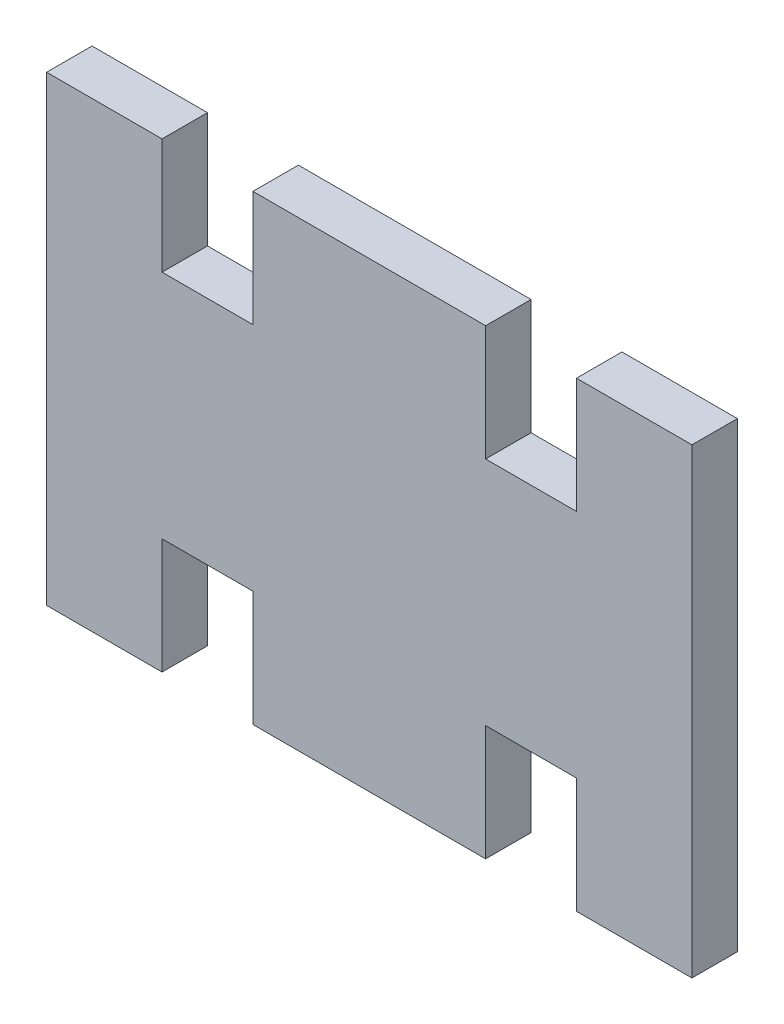
ISO-10303-21;
HEADER;
FILE_DESCRIPTION(('STEP AP214'),'2;1');
FILE_NAME('part.step','',(''),(''),'','','');
FILE_SCHEMA(('AUTOMOTIVE_DESIGN { 1 0 10303 214 1 1 1 1 }'));
ENDSEC;
DATA;
#1=APPLICATION_CONTEXT('core data for automotive mechanical design processes');
#2=APPLICATION_PROTOCOL_DEFINITION('international standard','automotive_design',2000,#1);
#3=PRODUCT_CONTEXT('',#1,'mechanical');
#4=PRODUCT('Part','Part','',(#3));
#5=PRODUCT_RELATED_PRODUCT_CATEGORY('part','',(#4));
#6=PRODUCT_DEFINITION_FORMATION('','',#4);
#7=PRODUCT_DEFINITION_CONTEXT('part definition',#1,'design');
#8=PRODUCT_DEFINITION('design','',#6,#7);
#9=PRODUCT_DEFINITION_SHAPE('','',#8);
#10=(LENGTH_UNIT() NAMED_UNIT(*) SI_UNIT(.MILLI.,.METRE.));
#11=(NAMED_UNIT(*) PLANE_ANGLE_UNIT() SI_UNIT($,.RADIAN.));
#12=(NAMED_UNIT(*) SI_UNIT($,.STERADIAN.) SOLID_ANGLE_UNIT());
#13=UNCERTAINTY_MEASURE_WITH_UNIT(LENGTH_MEASURE(1.E-05),#10,'distance_accuracy_value','');
#14=(GEOMETRIC_REPRESENTATION_CONTEXT(3) GLOBAL_UNCERTAINTY_ASSIGNED_CONTEXT((#13)) GLOBAL_UNIT_ASSIGNED_CONTEXT((#10,
#11,#12)) REPRESENTATION_CONTEXT('',''));
#15=CARTESIAN_POINT('',(0.,0.,0.));
#16=DIRECTION('',(0.,0.,1.));
#17=DIRECTION('',(1.,0.,0.));
#18=AXIS2_PLACEMENT_3D('',#15,#16,#17);
#19=CARTESIAN_POINT('',(-35.5,-25.4,5.));
#20=DIRECTION('',(1.,0.,0.));
#21=DIRECTION('',(0.,0.,-1.));
#22=AXIS2_PLACEMENT_3D('',#19,#20,#21);
#23=PLANE('',#22);
#24=DIRECTION('',(0.,-1.,0.));
#25=VECTOR('',#24,1.);
#26=CARTESIAN_POINT('',(-35.5,-25.4,0.));
#27=LINE('',#26,#25);
#28=CARTESIAN_POINT('',(-35.5,25.4,0.));
#29=VERTEX_POINT('',#28);
#30=CARTESIAN_POINT('',(-35.5,-25.4,0.));
#31=VERTEX_POINT('',#30);
#32=EDGE_CURVE('E205',#29,#31,#27,.T.);
#33=ORIENTED_EDGE('',*,*,#32,.T.);
#34=DIRECTION('',(0.,0.,-1.));
#35=VECTOR('',#34,1.);
#36=CARTESIAN_POINT('',(-35.5,-25.4,5.));
#37=LINE('',#36,#35);
#38=CARTESIAN_POINT('',(-35.5,-25.4,5.));
#39=VERTEX_POINT('',#38);
#40=EDGE_CURVE('E11',#39,#31,#37,.T.);
#41=ORIENTED_EDGE('',*,*,#40,.F.);
#42=DIRECTION('',(0.,-1.,0.));
#43=VECTOR('',#42,1.);
#44=CARTESIAN_POINT('',(-35.5,-25.4,5.));
#45=LINE('',#44,#43);
#46=CARTESIAN_POINT('',(-35.5,25.4,5.));
#47=VERTEX_POINT('',#46);
#48=EDGE_CURVE('E243',#47,#39,#45,.T.);
#49=ORIENTED_EDGE('',*,*,#48,.F.);
#50=DIRECTION('',(0.,0.,-1.));
#51=VECTOR('',#50,1.);
#52=CARTESIAN_POINT('',(-35.5,25.4,5.));
#53=LINE('',#52,#51);
#54=EDGE_CURVE('E201',#47,#29,#53,.T.);
#55=ORIENTED_EDGE('',*,*,#54,.T.);
#56=EDGE_LOOP('',(#33,#41,#49,#55));
#57=FACE_BOUND('',#56,.T.);
#58=ADVANCED_FACE('F37',(#57),#23,.F.);
#59=CARTESIAN_POINT('',(-35.5,-25.4,5.));
#60=DIRECTION('',(0.,1.,0.));
#61=DIRECTION('',(-1.,0.,0.));
#62=AXIS2_PLACEMENT_3D('',#59,#60,#61);
#63=PLANE('',#62);
#64=DIRECTION('',(1.,0.,0.));
#65=VECTOR('',#64,1.);
#66=CARTESIAN_POINT('',(-35.5,-25.4,0.));
#67=LINE('',#66,#65);
#68=CARTESIAN_POINT('',(-22.8,-25.4,0.));
#69=VERTEX_POINT('',#68);
#70=EDGE_CURVE('E208',#31,#69,#67,.T.);
#71=ORIENTED_EDGE('',*,*,#70,.T.);
#72=DIRECTION('',(0.,0.,-1.));
#73=VECTOR('',#72,1.);
#74=CARTESIAN_POINT('',(-22.8,-25.4,5.));
#75=LINE('',#74,#73);
#76=CARTESIAN_POINT('',(-22.8,-25.4,5.));
#77=VERTEX_POINT('',#76);
#78=EDGE_CURVE('E45',#77,#69,#75,.T.);
#79=ORIENTED_EDGE('',*,*,#78,.F.);
#80=DIRECTION('',(1.,0.,0.));
#81=VECTOR('',#80,1.);
#82=CARTESIAN_POINT('',(-35.5,-25.4,5.));
#83=LINE('',#82,#81);
#84=EDGE_CURVE('E132',#39,#77,#83,.T.);
#85=ORIENTED_EDGE('',*,*,#84,.F.);
#86=ORIENTED_EDGE('',*,*,#40,.T.);
#87=EDGE_LOOP('',(#71,#79,#85,#86));
#88=FACE_BOUND('',#87,.T.);
#89=ADVANCED_FACE('F361',(#88),#63,.F.);
#90=CARTESIAN_POINT('',(-22.8,-25.4,5.));
#91=DIRECTION('',(-1.,0.,0.));
#92=DIRECTION('',(0.,0.,1.));
#93=AXIS2_PLACEMENT_3D('',#90,#91,#92);
#94=PLANE('',#93);
#95=DIRECTION('',(0.,1.,0.));
#96=VECTOR('',#95,1.);
#97=CARTESIAN_POINT('',(-22.8,-25.4,0.));
#98=LINE('',#97,#96);
#99=CARTESIAN_POINT('',(-22.8,-12.7,0.));
#100=VERTEX_POINT('',#99);
#101=EDGE_CURVE('E210',#69,#100,#98,.T.);
#102=ORIENTED_EDGE('',*,*,#101,.T.);
#103=DIRECTION('',(0.,0.,-1.));
#104=VECTOR('',#103,1.);
#105=CARTESIAN_POINT('',(-22.8,-12.7,5.));
#106=LINE('',#105,#104);
#107=CARTESIAN_POINT('',(-22.8,-12.7,5.));
#108=VERTEX_POINT('',#107);
#109=EDGE_CURVE('E286',#108,#100,#106,.T.);
#110=ORIENTED_EDGE('',*,*,#109,.F.);
#111=DIRECTION('',(0.,1.,0.));
#112=VECTOR('',#111,1.);
#113=CARTESIAN_POINT('',(-22.8,-25.4,5.));
#114=LINE('',#113,#112);
#115=EDGE_CURVE('E294',#77,#108,#114,.T.);
#116=ORIENTED_EDGE('',*,*,#115,.F.);
#117=ORIENTED_EDGE('',*,*,#78,.T.);
#118=EDGE_LOOP('',(#102,#110,#116,#117));
#119=FACE_BOUND('',#118,.T.);
#120=ADVANCED_FACE('F292',(#119),#94,.F.);
#121=CARTESIAN_POINT('',(-22.8,-12.7,5.));
#122=DIRECTION('',(0.,1.,0.));
#123=DIRECTION('',(-1.,0.,0.));
#124=AXIS2_PLACEMENT_3D('',#121,#122,#123);
#125=PLANE('',#124);
#126=DIRECTION('',(1.,0.,0.));
#127=VECTOR('',#126,1.);
#128=CARTESIAN_POINT('',(-22.8,-12.7,0.));
#129=LINE('',#128,#127);
#130=CARTESIAN_POINT('',(-12.8,-12.7,0.));
#131=VERTEX_POINT('',#130);
#132=EDGE_CURVE('E212',#100,#131,#129,.T.);
#133=ORIENTED_EDGE('',*,*,#132,.T.);
#134=DIRECTION('',(0.,0.,-1.));
#135=VECTOR('',#134,1.);
#136=CARTESIAN_POINT('',(-12.8,-12.7,5.));
#137=LINE('',#136,#135);
#138=CARTESIAN_POINT('',(-12.8,-12.7,5.));
#139=VERTEX_POINT('',#138);
#140=EDGE_CURVE('E283',#139,#131,#137,.T.);
#141=ORIENTED_EDGE('',*,*,#140,.F.);
#142=DIRECTION('',(1.,0.,0.));
#143=VECTOR('',#142,1.);
#144=CARTESIAN_POINT('',(-22.8,-12.7,5.));
#145=LINE('',#144,#143);
#146=EDGE_CURVE('E312',#108,#139,#145,.T.);
#147=ORIENTED_EDGE('',*,*,#146,.F.);
#148=ORIENTED_EDGE('',*,*,#109,.T.);
#149=EDGE_LOOP('',(#133,#141,#147,#148));
#150=FACE_BOUND('',#149,.T.);
#151=ADVANCED_FACE('F303',(#150),#125,.F.);
#152=CARTESIAN_POINT('',(-12.8,-12.7,5.));
#153=DIRECTION('',(1.,0.,0.));
#154=DIRECTION('',(0.,1.,0.));
#155=AXIS2_PLACEMENT_3D('',#152,#153,#154);
#156=PLANE('',#155);
#157=DIRECTION('',(0.,-1.,0.));
#158=VECTOR('',#157,1.);
#159=CARTESIAN_POINT('',(-12.8,-12.7,0.));
#160=LINE('',#159,#158);
#161=CARTESIAN_POINT('',(-12.8,-25.4,0.));
#162=VERTEX_POINT('',#161);
#163=EDGE_CURVE('E214',#131,#162,#160,.T.);
#164=ORIENTED_EDGE('',*,*,#163,.T.);
#165=DIRECTION('',(0.,0.,-1.));
#166=VECTOR('',#165,1.);
#167=CARTESIAN_POINT('',(-12.8,-25.4,5.));
#168=LINE('',#167,#166);
#169=CARTESIAN_POINT('',(-12.8,-25.4,5.));
#170=VERTEX_POINT('',#169);
#171=EDGE_CURVE('E280',#170,#162,#168,.T.);
#172=ORIENTED_EDGE('',*,*,#171,.F.);
#173=DIRECTION('',(0.,-1.,0.));
#174=VECTOR('',#173,1.);
#175=CARTESIAN_POINT('',(-12.8,-12.7,5.));
#176=LINE('',#175,#174);
#177=EDGE_CURVE('E309',#139,#170,#176,.T.);
#178=ORIENTED_EDGE('',*,*,#177,.F.);
#179=ORIENTED_EDGE('',*,*,#140,.T.);
#180=EDGE_LOOP('',(#164,#172,#178,#179));
#181=FACE_BOUND('',#180,.T.);
#182=ADVANCED_FACE('F307',(#181),#156,.F.);
#183=CARTESIAN_POINT('',(-12.8,-25.4,5.));
#184=DIRECTION('',(0.,1.,0.));
#185=DIRECTION('',(0.,0.,1.));
#186=AXIS2_PLACEMENT_3D('',#183,#184,#185);
#187=PLANE('',#186);
#188=DIRECTION('',(1.,0.,0.));
#189=VECTOR('',#188,1.);
#190=CARTESIAN_POINT('',(-12.8,-25.4,0.));
#191=LINE('',#190,#189);
#192=CARTESIAN_POINT('',(12.8,-25.4,0.));
#193=VERTEX_POINT('',#192);
#194=EDGE_CURVE('E216',#162,#193,#191,.T.);
#195=ORIENTED_EDGE('',*,*,#194,.T.);
#196=DIRECTION('',(0.,0.,-1.));
#197=VECTOR('',#196,1.);
#198=CARTESIAN_POINT('',(12.8,-25.4,5.));
#199=LINE('',#198,#197);
#200=CARTESIAN_POINT('',(12.8,-25.4,5.));
#201=VERTEX_POINT('',#200);
#202=EDGE_CURVE('E277',#201,#193,#199,.T.);
#203=ORIENTED_EDGE('',*,*,#202,.F.);
#204=DIRECTION('',(1.,0.,0.));
#205=VECTOR('',#204,1.);
#206=CARTESIAN_POINT('',(-12.8,-25.4,5.));
#207=LINE('',#206,#205);
#208=EDGE_CURVE('E311',#170,#201,#207,.T.);
#209=ORIENTED_EDGE('',*,*,#208,.F.);
#210=ORIENTED_EDGE('',*,*,#171,.T.);
#211=EDGE_LOOP('',(#195,#203,#209,#210));
#212=FACE_BOUND('',#211,.T.);
#213=ADVANCED_FACE('F374',(#212),#187,.F.);
#214=CARTESIAN_POINT('',(12.8,-12.7,5.));
#215=DIRECTION('',(-1.,0.,0.));
#216=DIRECTION('',(0.,0.,1.));
#217=AXIS2_PLACEMENT_3D('',#214,#215,#216);
#218=PLANE('',#217);
#219=DIRECTION('',(0.,1.,0.));
#220=VECTOR('',#219,1.);
#221=CARTESIAN_POINT('',(12.8,-12.7,0.));
#222=LINE('',#221,#220);
#223=CARTESIAN_POINT('',(12.8,-12.7,0.));
#224=VERTEX_POINT('',#223);
#225=EDGE_CURVE('E218',#193,#224,#222,.T.);
#226=ORIENTED_EDGE('',*,*,#225,.T.);
#227=DIRECTION('',(0.,0.,-1.));
#228=VECTOR('',#227,1.);
#229=CARTESIAN_POINT('',(12.8,-12.7,5.));
#230=LINE('',#229,#228);
#231=CARTESIAN_POINT('',(12.8,-12.7,5.));
#232=VERTEX_POINT('',#231);
#233=EDGE_CURVE('E274',#232,#224,#230,.T.);
#234=ORIENTED_EDGE('',*,*,#233,.F.);
#235=DIRECTION('',(0.,1.,0.));
#236=VECTOR('',#235,1.);
#237=CARTESIAN_POINT('',(12.8,-12.7,5.));
#238=LINE('',#237,#236);
#239=EDGE_CURVE('E314',#201,#232,#238,.T.);
#240=ORIENTED_EDGE('',*,*,#239,.F.);
#241=ORIENTED_EDGE('',*,*,#202,.T.);
#242=EDGE_LOOP('',(#226,#234,#240,#241));
#243=FACE_BOUND('',#242,.T.);
#244=ADVANCED_FACE('F377',(#243),#218,.F.);
#245=CARTESIAN_POINT('',(22.8,-12.7,5.));
#246=DIRECTION('',(0.,1.,0.));
#247=DIRECTION('',(-1.,0.,0.));
#248=AXIS2_PLACEMENT_3D('',#245,#246,#247);
#249=PLANE('',#248);
#250=DIRECTION('',(1.,0.,0.));
#251=VECTOR('',#250,1.);
#252=CARTESIAN_POINT('',(22.8,-12.7,0.));
#253=LINE('',#252,#251);
#254=CARTESIAN_POINT('',(22.8,-12.7,0.));
#255=VERTEX_POINT('',#254);
#256=EDGE_CURVE('E220',#224,#255,#253,.T.);
#257=ORIENTED_EDGE('',*,*,#256,.T.);
#258=DIRECTION('',(0.,0.,-1.));
#259=VECTOR('',#258,1.);
#260=CARTESIAN_POINT('',(22.8,-12.7,5.));
#261=LINE('',#260,#259);
#262=CARTESIAN_POINT('',(22.8,-12.7,5.));
#263=VERTEX_POINT('',#262);
#264=EDGE_CURVE('E271',#263,#255,#261,.T.);
#265=ORIENTED_EDGE('',*,*,#264,.F.);
#266=DIRECTION('',(1.,0.,0.));
#267=VECTOR('',#266,1.);
#268=CARTESIAN_POINT('',(22.8,-12.7,5.));
#269=LINE('',#268,#267);
#270=EDGE_CURVE('E320',#232,#263,#269,.T.);
#271=ORIENTED_EDGE('',*,*,#270,.F.);
#272=ORIENTED_EDGE('',*,*,#233,.T.);
#273=EDGE_LOOP('',(#257,#265,#271,#272));
#274=FACE_BOUND('',#273,.T.);
#275=ADVANCED_FACE('F381',(#274),#249,.F.);
#276=CARTESIAN_POINT('',(22.8,-25.4,5.));
#277=DIRECTION('',(1.,0.,0.));
#278=DIRECTION('',(0.,0.,-1.));
#279=AXIS2_PLACEMENT_3D('',#276,#277,#278);
#280=PLANE('',#279);
#281=DIRECTION('',(0.,-1.,0.));
#282=VECTOR('',#281,1.);
#283=CARTESIAN_POINT('',(22.8,-25.4,0.));
#284=LINE('',#283,#282);
#285=CARTESIAN_POINT('',(22.8,-25.4,0.));
#286=VERTEX_POINT('',#285);
#287=EDGE_CURVE('E222',#255,#286,#284,.T.);
#288=ORIENTED_EDGE('',*,*,#287,.T.);
#289=DIRECTION('',(0.,0.,-1.));
#290=VECTOR('',#289,1.);
#291=CARTESIAN_POINT('',(22.8,-25.4,5.));
#292=LINE('',#291,#290);
#293=CARTESIAN_POINT('',(22.8,-25.4,5.));
#294=VERTEX_POINT('',#293);
#295=EDGE_CURVE('E268',#294,#286,#292,.T.);
#296=ORIENTED_EDGE('',*,*,#295,.F.);
#297=DIRECTION('',(0.,-1.,0.));
#298=VECTOR('',#297,1.);
#299=CARTESIAN_POINT('',(22.8,-25.4,5.));
#300=LINE('',#299,#298);
#301=EDGE_CURVE('E322',#263,#294,#300,.T.);
#302=ORIENTED_EDGE('',*,*,#301,.F.);
#303=ORIENTED_EDGE('',*,*,#264,.T.);
#304=EDGE_LOOP('',(#288,#296,#302,#303));
#305=FACE_BOUND('',#304,.T.);
#306=ADVANCED_FACE('F385',(#305),#280,.F.);
#307=CARTESIAN_POINT('',(35.5,-25.4,5.));
#308=DIRECTION('',(0.,1.,0.));
#309=DIRECTION('',(-1.,0.,0.));
#310=AXIS2_PLACEMENT_3D('',#307,#308,#309);
#311=PLANE('',#310);
#312=DIRECTION('',(1.,0.,0.));
#313=VECTOR('',#312,1.);
#314=CARTESIAN_POINT('',(35.5,-25.4,0.));
#315=LINE('',#314,#313);
#316=CARTESIAN_POINT('',(35.5,-25.4,0.));
#317=VERTEX_POINT('',#316);
#318=EDGE_CURVE('E224',#286,#317,#315,.T.);
#319=ORIENTED_EDGE('',*,*,#318,.T.);
#320=DIRECTION('',(0.,0.,-1.));
#321=VECTOR('',#320,1.);
#322=CARTESIAN_POINT('',(35.5,-25.4,5.));
#323=LINE('',#322,#321);
#324=CARTESIAN_POINT('',(35.5,-25.4,5.));
#325=VERTEX_POINT('',#324);
#326=EDGE_CURVE('E265',#325,#317,#323,.T.);
#327=ORIENTED_EDGE('',*,*,#326,.F.);
#328=DIRECTION('',(1.,0.,0.));
#329=VECTOR('',#328,1.);
#330=CARTESIAN_POINT('',(35.5,-25.4,5.));
#331=LINE('',#330,#329);
#332=EDGE_CURVE('E324',#294,#325,#331,.T.);
#333=ORIENTED_EDGE('',*,*,#332,.F.);
#334=ORIENTED_EDGE('',*,*,#295,.T.);
#335=EDGE_LOOP('',(#319,#327,#333,#334));
#336=FACE_BOUND('',#335,.T.);
#337=ADVANCED_FACE('F389',(#336),#311,.F.);
#338=CARTESIAN_POINT('',(35.5,-25.4,5.));
#339=DIRECTION('',(-1.,0.,0.));
#340=DIRECTION('',(0.,0.,1.));
#341=AXIS2_PLACEMENT_3D('',#338,#339,#340);
#342=PLANE('',#341);
#343=DIRECTION('',(0.,1.,0.));
#344=VECTOR('',#343,1.);
#345=CARTESIAN_POINT('',(35.5,-25.4,0.));
#346=LINE('',#345,#344);
#347=CARTESIAN_POINT('',(35.5,25.4,0.));
#348=VERTEX_POINT('',#347);
#349=EDGE_CURVE('E226',#317,#348,#346,.T.);
#350=ORIENTED_EDGE('',*,*,#349,.T.);
#351=DIRECTION('',(0.,0.,-1.));
#352=VECTOR('',#351,1.);
#353=CARTESIAN_POINT('',(35.5,25.4,5.));
#354=LINE('',#353,#352);
#355=CARTESIAN_POINT('',(35.5,25.4,5.));
#356=VERTEX_POINT('',#355);
#357=EDGE_CURVE('E262',#356,#348,#354,.T.);
#358=ORIENTED_EDGE('',*,*,#357,.F.);
#359=DIRECTION('',(0.,1.,0.));
#360=VECTOR('',#359,1.);
#361=CARTESIAN_POINT('',(35.5,-25.4,5.));
#362=LINE('',#361,#360);
#363=EDGE_CURVE('E326',#325,#356,#362,.T.);
#364=ORIENTED_EDGE('',*,*,#363,.F.);
#365=ORIENTED_EDGE('',*,*,#326,.T.);
#366=EDGE_LOOP('',(#350,#358,#364,#365));
#367=FACE_BOUND('',#366,.T.);
#368=ADVANCED_FACE('F393',(#367),#342,.F.);
#369=CARTESIAN_POINT('',(35.5,25.4,5.));
#370=DIRECTION('',(0.,-1.,0.));
#371=DIRECTION('',(1.,0.,0.));
#372=AXIS2_PLACEMENT_3D('',#369,#370,#371);
#373=PLANE('',#372);
#374=DIRECTION('',(-1.,0.,0.));
#375=VECTOR('',#374,1.);
#376=CARTESIAN_POINT('',(35.5,25.4,0.));
#377=LINE('',#376,#375);
#378=CARTESIAN_POINT('',(22.8,25.4,0.));
#379=VERTEX_POINT('',#378);
#380=EDGE_CURVE('E228',#348,#379,#377,.T.);
#381=ORIENTED_EDGE('',*,*,#380,.T.);
#382=DIRECTION('',(0.,0.,-1.));
#383=VECTOR('',#382,1.);
#384=CARTESIAN_POINT('',(22.8,25.4,5.));
#385=LINE('',#384,#383);
#386=CARTESIAN_POINT('',(22.8,25.4,5.));
#387=VERTEX_POINT('',#386);
#388=EDGE_CURVE('E259',#387,#379,#385,.T.);
#389=ORIENTED_EDGE('',*,*,#388,.F.);
#390=DIRECTION('',(-1.,0.,0.));
#391=VECTOR('',#390,1.);
#392=CARTESIAN_POINT('',(35.5,25.4,5.));
#393=LINE('',#392,#391);
#394=EDGE_CURVE('E328',#356,#387,#393,.T.);
#395=ORIENTED_EDGE('',*,*,#394,.F.);
#396=ORIENTED_EDGE('',*,*,#357,.T.);
#397=EDGE_LOOP('',(#381,#389,#395,#396));
#398=FACE_BOUND('',#397,.T.);
#399=ADVANCED_FACE('F397',(#398),#373,.F.);
#400=CARTESIAN_POINT('',(22.8,25.4,5.));
#401=DIRECTION('',(1.,0.,0.));
#402=DIRECTION('',(0.,0.,-1.));
#403=AXIS2_PLACEMENT_3D('',#400,#401,#402);
#404=PLANE('',#403);
#405=DIRECTION('',(0.,-1.,0.));
#406=VECTOR('',#405,1.);
#407=CARTESIAN_POINT('',(22.8,25.4,0.));
#408=LINE('',#407,#406);
#409=CARTESIAN_POINT('',(22.8,12.7,0.));
#410=VERTEX_POINT('',#409);
#411=EDGE_CURVE('E230',#379,#410,#408,.T.);
#412=ORIENTED_EDGE('',*,*,#411,.T.);
#413=DIRECTION('',(0.,0.,-1.));
#414=VECTOR('',#413,1.);
#415=CARTESIAN_POINT('',(22.8,12.7,5.));
#416=LINE('',#415,#414);
#417=CARTESIAN_POINT('',(22.8,12.7,5.));
#418=VERTEX_POINT('',#417);
#419=EDGE_CURVE('E256',#418,#410,#416,.T.);
#420=ORIENTED_EDGE('',*,*,#419,.F.);
#421=DIRECTION('',(0.,-1.,0.));
#422=VECTOR('',#421,1.);
#423=CARTESIAN_POINT('',(22.8,25.4,5.));
#424=LINE('',#423,#422);
#425=EDGE_CURVE('E330',#387,#418,#424,.T.);
#426=ORIENTED_EDGE('',*,*,#425,.F.);
#427=ORIENTED_EDGE('',*,*,#388,.T.);
#428=EDGE_LOOP('',(#412,#420,#426,#427));
#429=FACE_BOUND('',#428,.T.);
#430=ADVANCED_FACE('F401',(#429),#404,.F.);
#431=CARTESIAN_POINT('',(22.8,12.7,5.));
#432=DIRECTION('',(0.,-1.,0.));
#433=DIRECTION('',(1.,0.,0.));
#434=AXIS2_PLACEMENT_3D('',#431,#432,#433);
#435=PLANE('',#434);
#436=DIRECTION('',(-1.,0.,0.));
#437=VECTOR('',#436,1.);
#438=CARTESIAN_POINT('',(22.8,12.7,0.));
#439=LINE('',#438,#437);
#440=CARTESIAN_POINT('',(12.8,12.7,0.));
#441=VERTEX_POINT('',#440);
#442=EDGE_CURVE('E232',#410,#441,#439,.T.);
#443=ORIENTED_EDGE('',*,*,#442,.T.);
#444=DIRECTION('',(0.,0.,-1.));
#445=VECTOR('',#444,1.);
#446=CARTESIAN_POINT('',(12.8,12.7,5.));
#447=LINE('',#446,#445);
#448=CARTESIAN_POINT('',(12.8,12.7,5.));
#449=VERTEX_POINT('',#448);
#450=EDGE_CURVE('E253',#449,#441,#447,.T.);
#451=ORIENTED_EDGE('',*,*,#450,.F.);
#452=DIRECTION('',(-1.,0.,0.));
#453=VECTOR('',#452,1.);
#454=CARTESIAN_POINT('',(22.8,12.7,5.));
#455=LINE('',#454,#453);
#456=EDGE_CURVE('E332',#418,#449,#455,.T.);
#457=ORIENTED_EDGE('',*,*,#456,.F.);
#458=ORIENTED_EDGE('',*,*,#419,.T.);
#459=EDGE_LOOP('',(#443,#451,#457,#458));
#460=FACE_BOUND('',#459,.T.);
#461=ADVANCED_FACE('F405',(#460),#435,.F.);
#462=CARTESIAN_POINT('',(12.8,12.7,5.));
#463=DIRECTION('',(-1.,0.,0.));
#464=DIRECTION('',(0.,0.,1.));
#465=AXIS2_PLACEMENT_3D('',#462,#463,#464);
#466=PLANE('',#465);
#467=DIRECTION('',(0.,1.,0.));
#468=VECTOR('',#467,1.);
#469=CARTESIAN_POINT('',(12.8,12.7,0.));
#470=LINE('',#469,#468);
#471=CARTESIAN_POINT('',(12.8,25.4,0.));
#472=VERTEX_POINT('',#471);
#473=EDGE_CURVE('E234',#441,#472,#470,.T.);
#474=ORIENTED_EDGE('',*,*,#473,.T.);
#475=DIRECTION('',(0.,0.,-1.));
#476=VECTOR('',#475,1.);
#477=CARTESIAN_POINT('',(12.8,25.4,5.));
#478=LINE('',#477,#476);
#479=CARTESIAN_POINT('',(12.8,25.4,5.));
#480=VERTEX_POINT('',#479);
#481=EDGE_CURVE('E250',#480,#472,#478,.T.);
#482=ORIENTED_EDGE('',*,*,#481,.F.);
#483=DIRECTION('',(0.,1.,0.));
#484=VECTOR('',#483,1.);
#485=CARTESIAN_POINT('',(12.8,12.7,5.));
#486=LINE('',#485,#484);
#487=EDGE_CURVE('E334',#449,#480,#486,.T.);
#488=ORIENTED_EDGE('',*,*,#487,.F.);
#489=ORIENTED_EDGE('',*,*,#450,.T.);
#490=EDGE_LOOP('',(#474,#482,#488,#489));
#491=FACE_BOUND('',#490,.T.);
#492=ADVANCED_FACE('F409',(#491),#466,.F.);
#493=CARTESIAN_POINT('',(-12.8,25.4,5.));
#494=DIRECTION('',(0.,-1.,0.));
#495=DIRECTION('',(0.,0.,-1.));
#496=AXIS2_PLACEMENT_3D('',#493,#494,#495);
#497=PLANE('',#496);
#498=DIRECTION('',(-1.,0.,0.));
#499=VECTOR('',#498,1.);
#500=CARTESIAN_POINT('',(-12.8,25.4,0.));
#501=LINE('',#500,#499);
#502=CARTESIAN_POINT('',(-12.8,25.4,0.));
#503=VERTEX_POINT('',#502);
#504=EDGE_CURVE('E236',#472,#503,#501,.T.);
#505=ORIENTED_EDGE('',*,*,#504,.T.);
#506=DIRECTION('',(0.,0.,-1.));
#507=VECTOR('',#506,1.);
#508=CARTESIAN_POINT('',(-12.8,25.4,5.));
#509=LINE('',#508,#507);
#510=CARTESIAN_POINT('',(-12.8,25.4,5.));
#511=VERTEX_POINT('',#510);
#512=EDGE_CURVE('E247',#511,#503,#509,.T.);
#513=ORIENTED_EDGE('',*,*,#512,.F.);
#514=DIRECTION('',(-1.,0.,0.));
#515=VECTOR('',#514,1.);
#516=CARTESIAN_POINT('',(-12.8,25.4,5.));
#517=LINE('',#516,#515);
#518=EDGE_CURVE('E336',#480,#511,#517,.T.);
#519=ORIENTED_EDGE('',*,*,#518,.F.);
#520=ORIENTED_EDGE('',*,*,#481,.T.);
#521=EDGE_LOOP('',(#505,#513,#519,#520));
#522=FACE_BOUND('',#521,.T.);
#523=ADVANCED_FACE('F342',(#522),#497,.F.);
#524=CARTESIAN_POINT('',(-12.8,12.7,5.));
#525=DIRECTION('',(1.,0.,0.));
#526=DIRECTION('',(0.,0.,-1.));
#527=AXIS2_PLACEMENT_3D('',#524,#525,#526);
#528=PLANE('',#527);
#529=DIRECTION('',(0.,-1.,0.));
#530=VECTOR('',#529,1.);
#531=CARTESIAN_POINT('',(-12.8,12.7,0.));
#532=LINE('',#531,#530);
#533=CARTESIAN_POINT('',(-12.8,12.7,0.));
#534=VERTEX_POINT('',#533);
#535=EDGE_CURVE('E238',#503,#534,#532,.T.);
#536=ORIENTED_EDGE('',*,*,#535,.T.);
#537=DIRECTION('',(0.,0.,-1.));
#538=VECTOR('',#537,1.);
#539=CARTESIAN_POINT('',(-12.8,12.7,5.));
#540=LINE('',#539,#538);
#541=CARTESIAN_POINT('',(-12.8,12.7,5.));
#542=VERTEX_POINT('',#541);
#543=EDGE_CURVE('E196',#542,#534,#540,.T.);
#544=ORIENTED_EDGE('',*,*,#543,.F.);
#545=DIRECTION('',(0.,-1.,0.));
#546=VECTOR('',#545,1.);
#547=CARTESIAN_POINT('',(-12.8,12.7,5.));
#548=LINE('',#547,#546);
#549=EDGE_CURVE('E187',#511,#542,#548,.T.);
#550=ORIENTED_EDGE('',*,*,#549,.F.);
#551=ORIENTED_EDGE('',*,*,#512,.T.);
#552=EDGE_LOOP('',(#536,#544,#550,#551));
#553=FACE_BOUND('',#552,.T.);
#554=ADVANCED_FACE('F346',(#553),#528,.F.);
#555=CARTESIAN_POINT('',(-22.8,12.7,5.));
#556=DIRECTION('',(0.,-1.,0.));
#557=DIRECTION('',(1.,0.,0.));
#558=AXIS2_PLACEMENT_3D('',#555,#556,#557);
#559=PLANE('',#558);
#560=DIRECTION('',(-1.,0.,0.));
#561=VECTOR('',#560,1.);
#562=CARTESIAN_POINT('',(-22.8,12.7,0.));
#563=LINE('',#562,#561);
#564=CARTESIAN_POINT('',(-22.8,12.7,0.));
#565=VERTEX_POINT('',#564);
#566=EDGE_CURVE('E195',#534,#565,#563,.T.);
#567=ORIENTED_EDGE('',*,*,#566,.T.);
#568=DIRECTION('',(0.,0.,-1.));
#569=VECTOR('',#568,1.);
#570=CARTESIAN_POINT('',(-22.8,12.7,5.));
#571=LINE('',#570,#569);
#572=CARTESIAN_POINT('',(-22.8,12.7,5.));
#573=VERTEX_POINT('',#572);
#574=EDGE_CURVE('E192',#573,#565,#571,.T.);
#575=ORIENTED_EDGE('',*,*,#574,.F.);
#576=DIRECTION('',(-1.,0.,0.));
#577=VECTOR('',#576,1.);
#578=CARTESIAN_POINT('',(-22.8,12.7,5.));
#579=LINE('',#578,#577);
#580=EDGE_CURVE('E181',#542,#573,#579,.T.);
#581=ORIENTED_EDGE('',*,*,#580,.F.);
#582=ORIENTED_EDGE('',*,*,#543,.T.);
#583=EDGE_LOOP('',(#567,#575,#581,#582));
#584=FACE_BOUND('',#583,.T.);
#585=ADVANCED_FACE('F193',(#584),#559,.F.);
#586=CARTESIAN_POINT('',(-22.8,25.4,5.));
#587=DIRECTION('',(-1.,0.,0.));
#588=DIRECTION('',(0.,0.,1.));
#589=AXIS2_PLACEMENT_3D('',#586,#587,#588);
#590=PLANE('',#589);
#591=DIRECTION('',(0.,1.,0.));
#592=VECTOR('',#591,1.);
#593=CARTESIAN_POINT('',(-22.8,25.4,0.));
#594=LINE('',#593,#592);
#595=CARTESIAN_POINT('',(-22.8,25.4,0.));
#596=VERTEX_POINT('',#595);
#597=EDGE_CURVE('E118',#565,#596,#594,.T.);
#598=ORIENTED_EDGE('',*,*,#597,.T.);
#599=DIRECTION('',(0.,0.,-1.));
#600=VECTOR('',#599,1.);
#601=CARTESIAN_POINT('',(-22.8,25.4,5.));
#602=LINE('',#601,#600);
#603=CARTESIAN_POINT('',(-22.8,25.4,5.));
#604=VERTEX_POINT('',#603);
#605=EDGE_CURVE('E197',#604,#596,#602,.T.);
#606=ORIENTED_EDGE('',*,*,#605,.F.);
#607=DIRECTION('',(0.,1.,0.));
#608=VECTOR('',#607,1.);
#609=CARTESIAN_POINT('',(-22.8,25.4,5.));
#610=LINE('',#609,#608);
#611=EDGE_CURVE('E185',#573,#604,#610,.T.);
#612=ORIENTED_EDGE('',*,*,#611,.F.);
#613=ORIENTED_EDGE('',*,*,#574,.T.);
#614=EDGE_LOOP('',(#598,#606,#612,#613));
#615=FACE_BOUND('',#614,.T.);
#616=ADVANCED_FACE('F199',(#615),#590,.F.);
#617=CARTESIAN_POINT('',(-35.5,25.4,5.));
#618=DIRECTION('',(0.,-1.,0.));
#619=DIRECTION('',(1.,0.,0.));
#620=AXIS2_PLACEMENT_3D('',#617,#618,#619);
#621=PLANE('',#620);
#622=DIRECTION('',(-1.,0.,0.));
#623=VECTOR('',#622,1.);
#624=CARTESIAN_POINT('',(-35.5,25.4,0.));
#625=LINE('',#624,#623);
#626=EDGE_CURVE('E124',#596,#29,#625,.T.);
#627=ORIENTED_EDGE('',*,*,#626,.T.);
#628=ORIENTED_EDGE('',*,*,#54,.F.);
#629=DIRECTION('',(-1.,0.,0.));
#630=VECTOR('',#629,1.);
#631=CARTESIAN_POINT('',(-35.5,25.4,5.));
#632=LINE('',#631,#630);
#633=EDGE_CURVE('E53',#604,#47,#632,.T.);
#634=ORIENTED_EDGE('',*,*,#633,.F.);
#635=ORIENTED_EDGE('',*,*,#605,.T.);
#636=EDGE_LOOP('',(#627,#628,#634,#635));
#637=FACE_BOUND('',#636,.T.);
#638=ADVANCED_FACE('F350',(#637),#621,.F.);
#639=CARTESIAN_POINT('',(0.,0.,5.));
#640=DIRECTION('',(0.,0.,-1.));
#641=DIRECTION('',(-1.,0.,0.));
#642=AXIS2_PLACEMENT_3D('',#639,#640,#641);
#643=PLANE('',#642);
#644=ORIENTED_EDGE('',*,*,#48,.T.);
#645=ORIENTED_EDGE('',*,*,#84,.T.);
#646=ORIENTED_EDGE('',*,*,#115,.T.);
#647=ORIENTED_EDGE('',*,*,#146,.T.);
#648=ORIENTED_EDGE('',*,*,#177,.T.);
#649=ORIENTED_EDGE('',*,*,#208,.T.);
#650=ORIENTED_EDGE('',*,*,#239,.T.);
#651=ORIENTED_EDGE('',*,*,#270,.T.);
#652=ORIENTED_EDGE('',*,*,#301,.T.);
#653=ORIENTED_EDGE('',*,*,#332,.T.);
#654=ORIENTED_EDGE('',*,*,#363,.T.);
#655=ORIENTED_EDGE('',*,*,#394,.T.);
#656=ORIENTED_EDGE('',*,*,#425,.T.);
#657=ORIENTED_EDGE('',*,*,#456,.T.);
#658=ORIENTED_EDGE('',*,*,#487,.T.);
#659=ORIENTED_EDGE('',*,*,#518,.T.);
#660=ORIENTED_EDGE('',*,*,#549,.T.);
#661=ORIENTED_EDGE('',*,*,#580,.T.);
#662=ORIENTED_EDGE('',*,*,#611,.T.);
#663=ORIENTED_EDGE('',*,*,#633,.T.);
#664=EDGE_LOOP('',(#644,#645,#646,#647,#648,#649,#650,#651,#652,#653,#654,#655,#656,#657,#658,
#659,#660,#661,#662,#663));
#665=FACE_BOUND('',#664,.T.);
#666=ADVANCED_FACE('F183',(#665),#643,.F.);
#667=CARTESIAN_POINT('',(0.,0.,0.));
#668=DIRECTION('',(0.,0.,-1.));
#669=DIRECTION('',(-1.,0.,0.));
#670=AXIS2_PLACEMENT_3D('',#667,#668,#669);
#671=PLANE('',#670);
#672=ORIENTED_EDGE('',*,*,#32,.F.);
#673=ORIENTED_EDGE('',*,*,#626,.F.);
#674=ORIENTED_EDGE('',*,*,#597,.F.);
#675=ORIENTED_EDGE('',*,*,#566,.F.);
#676=ORIENTED_EDGE('',*,*,#535,.F.);
#677=ORIENTED_EDGE('',*,*,#504,.F.);
#678=ORIENTED_EDGE('',*,*,#473,.F.);
#679=ORIENTED_EDGE('',*,*,#442,.F.);
#680=ORIENTED_EDGE('',*,*,#411,.F.);
#681=ORIENTED_EDGE('',*,*,#380,.F.);
#682=ORIENTED_EDGE('',*,*,#349,.F.);
#683=ORIENTED_EDGE('',*,*,#318,.F.);
#684=ORIENTED_EDGE('',*,*,#287,.F.);
#685=ORIENTED_EDGE('',*,*,#256,.F.);
#686=ORIENTED_EDGE('',*,*,#225,.F.);
#687=ORIENTED_EDGE('',*,*,#194,.F.);
#688=ORIENTED_EDGE('',*,*,#163,.F.);
#689=ORIENTED_EDGE('',*,*,#132,.F.);
#690=ORIENTED_EDGE('',*,*,#101,.F.);
#691=ORIENTED_EDGE('',*,*,#70,.F.);
#692=EDGE_LOOP('',(#672,#673,#674,#675,#676,#677,#678,#679,#680,#681,#682,#683,#684,#685,#686,
#687,#688,#689,#690,#691));
#693=FACE_BOUND('',#692,.T.);
#694=ADVANCED_FACE('F298',(#693),#671,.T.);
#695=CLOSED_SHELL('',(#58,#89,#120,#151,#182,#213,#244,#275,#306,#337,#368,#399,#430,#461,#492,
#523,#554,#585,#616,#638,#666,#694));
#696=MANIFOLD_SOLID_BREP('B2',#695);
#697=ADVANCED_BREP_SHAPE_REPRESENTATION('',(#18,#696),#14);
#698=SHAPE_DEFINITION_REPRESENTATION(#9,#697);
ENDSEC;
END-ISO-10303-21;
